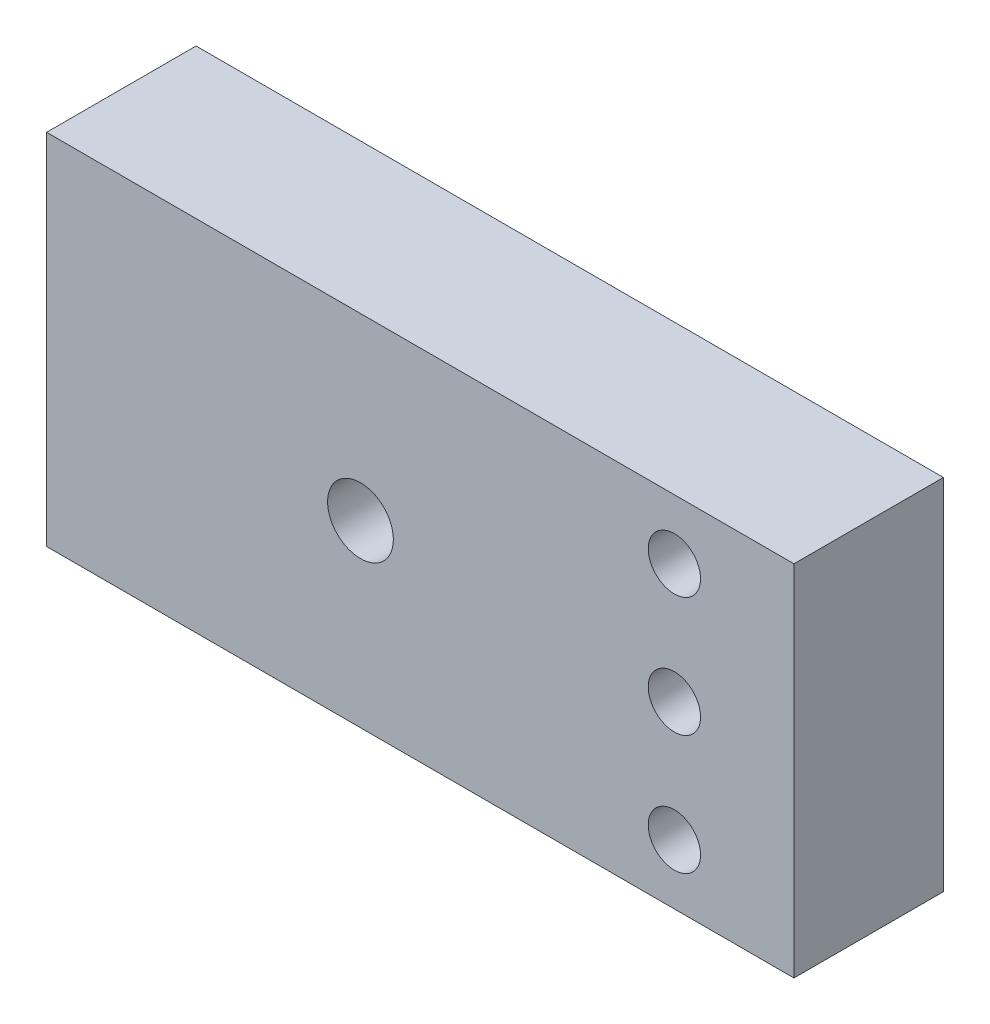
ISO-10303-21;
HEADER;
FILE_DESCRIPTION(('STEP AP214'),'2;1');
FILE_NAME('part.step','',(''),(''),'','','');
FILE_SCHEMA(('AUTOMOTIVE_DESIGN { 1 0 10303 214 1 1 1 1 }'));
ENDSEC;
DATA;
#1=APPLICATION_CONTEXT('core data for automotive mechanical design processes');
#2=APPLICATION_PROTOCOL_DEFINITION('international standard','automotive_design',2000,#1);
#3=PRODUCT_CONTEXT('',#1,'mechanical');
#4=PRODUCT('Part','Part','',(#3));
#5=PRODUCT_RELATED_PRODUCT_CATEGORY('part','',(#4));
#6=PRODUCT_DEFINITION_FORMATION('','',#4);
#7=PRODUCT_DEFINITION_CONTEXT('part definition',#1,'design');
#8=PRODUCT_DEFINITION('design','',#6,#7);
#9=PRODUCT_DEFINITION_SHAPE('','',#8);
#10=(LENGTH_UNIT() NAMED_UNIT(*) SI_UNIT(.MILLI.,.METRE.));
#11=(NAMED_UNIT(*) PLANE_ANGLE_UNIT() SI_UNIT($,.RADIAN.));
#12=(NAMED_UNIT(*) SI_UNIT($,.STERADIAN.) SOLID_ANGLE_UNIT());
#13=UNCERTAINTY_MEASURE_WITH_UNIT(LENGTH_MEASURE(1.E-05),#10,'distance_accuracy_value','');
#14=(GEOMETRIC_REPRESENTATION_CONTEXT(3) GLOBAL_UNCERTAINTY_ASSIGNED_CONTEXT((#13)) GLOBAL_UNIT_ASSIGNED_CONTEXT((#10,
#11,#12)) REPRESENTATION_CONTEXT('',''));
#15=CARTESIAN_POINT('',(0.,0.,0.));
#16=DIRECTION('',(0.,0.,1.));
#17=DIRECTION('',(1.,0.,0.));
#18=AXIS2_PLACEMENT_3D('',#15,#16,#17);
#19=CARTESIAN_POINT('',(125.,-60.,-50.));
#20=DIRECTION('',(1.,0.,0.));
#21=DIRECTION('',(0.,0.,-1.));
#22=AXIS2_PLACEMENT_3D('',#19,#20,#21);
#23=PLANE('',#22);
#24=DIRECTION('',(0.,1.,0.));
#25=VECTOR('',#24,1.);
#26=CARTESIAN_POINT('',(125.,-60.,0.));
#27=LINE('',#26,#25);
#28=CARTESIAN_POINT('',(125.,-60.,0.));
#29=VERTEX_POINT('',#28);
#30=CARTESIAN_POINT('',(125.,60.,0.));
#31=VERTEX_POINT('',#30);
#32=EDGE_CURVE('E102',#29,#31,#27,.T.);
#33=ORIENTED_EDGE('',*,*,#32,.F.);
#34=DIRECTION('',(0.,0.,1.));
#35=VECTOR('',#34,1.);
#36=CARTESIAN_POINT('',(125.,-60.,-50.));
#37=LINE('',#36,#35);
#38=CARTESIAN_POINT('',(125.,-60.,-50.));
#39=VERTEX_POINT('',#38);
#40=EDGE_CURVE('E11',#39,#29,#37,.T.);
#41=ORIENTED_EDGE('',*,*,#40,.F.);
#42=DIRECTION('',(0.,1.,0.));
#43=VECTOR('',#42,1.);
#44=CARTESIAN_POINT('',(125.,-60.,-50.));
#45=LINE('',#44,#43);
#46=CARTESIAN_POINT('',(125.,60.,-50.));
#47=VERTEX_POINT('',#46);
#48=EDGE_CURVE('E95',#39,#47,#45,.T.);
#49=ORIENTED_EDGE('',*,*,#48,.T.);
#50=DIRECTION('',(0.,0.,1.));
#51=VECTOR('',#50,1.);
#52=CARTESIAN_POINT('',(125.,60.,-50.));
#53=LINE('',#52,#51);
#54=EDGE_CURVE('E40',#47,#31,#53,.T.);
#55=ORIENTED_EDGE('',*,*,#54,.T.);
#56=EDGE_LOOP('',(#33,#41,#49,#55));
#57=FACE_BOUND('',#56,.T.);
#58=ADVANCED_FACE('F37',(#57),#23,.T.);
#59=CARTESIAN_POINT('',(-125.,-60.,-50.));
#60=DIRECTION('',(0.,-1.,0.));
#61=DIRECTION('',(0.,0.,-1.));
#62=AXIS2_PLACEMENT_3D('',#59,#60,#61);
#63=PLANE('',#62);
#64=DIRECTION('',(1.,0.,0.));
#65=VECTOR('',#64,1.);
#66=CARTESIAN_POINT('',(-125.,-60.,0.));
#67=LINE('',#66,#65);
#68=CARTESIAN_POINT('',(-125.,-60.,0.));
#69=VERTEX_POINT('',#68);
#70=EDGE_CURVE('E97',#69,#29,#67,.T.);
#71=ORIENTED_EDGE('',*,*,#70,.F.);
#72=DIRECTION('',(0.,0.,1.));
#73=VECTOR('',#72,1.);
#74=CARTESIAN_POINT('',(-125.,-60.,-50.));
#75=LINE('',#74,#73);
#76=CARTESIAN_POINT('',(-125.,-60.,-50.));
#77=VERTEX_POINT('',#76);
#78=EDGE_CURVE('E46',#77,#69,#75,.T.);
#79=ORIENTED_EDGE('',*,*,#78,.F.);
#80=DIRECTION('',(1.,0.,0.));
#81=VECTOR('',#80,1.);
#82=CARTESIAN_POINT('',(-125.,-60.,-50.));
#83=LINE('',#82,#81);
#84=EDGE_CURVE('E92',#77,#39,#83,.T.);
#85=ORIENTED_EDGE('',*,*,#84,.T.);
#86=ORIENTED_EDGE('',*,*,#40,.T.);
#87=EDGE_LOOP('',(#71,#79,#85,#86));
#88=FACE_BOUND('',#87,.T.);
#89=ADVANCED_FACE('F113',(#88),#63,.T.);
#90=CARTESIAN_POINT('',(-125.,-60.,-50.));
#91=DIRECTION('',(-1.,0.,0.));
#92=DIRECTION('',(0.,0.,1.));
#93=AXIS2_PLACEMENT_3D('',#90,#91,#92);
#94=PLANE('',#93);
#95=DIRECTION('',(0.,-1.,0.));
#96=VECTOR('',#95,1.);
#97=CARTESIAN_POINT('',(-125.,-60.,0.));
#98=LINE('',#97,#96);
#99=CARTESIAN_POINT('',(-125.,60.,0.));
#100=VERTEX_POINT('',#99);
#101=EDGE_CURVE('E87',#100,#69,#98,.T.);
#102=ORIENTED_EDGE('',*,*,#101,.F.);
#103=DIRECTION('',(0.,0.,1.));
#104=VECTOR('',#103,1.);
#105=CARTESIAN_POINT('',(-125.,60.,-50.));
#106=LINE('',#105,#104);
#107=CARTESIAN_POINT('',(-125.,60.,-50.));
#108=VERTEX_POINT('',#107);
#109=EDGE_CURVE('E82',#108,#100,#106,.T.);
#110=ORIENTED_EDGE('',*,*,#109,.F.);
#111=DIRECTION('',(0.,-1.,0.));
#112=VECTOR('',#111,1.);
#113=CARTESIAN_POINT('',(-125.,-60.,-50.));
#114=LINE('',#113,#112);
#115=EDGE_CURVE('E85',#108,#77,#114,.T.);
#116=ORIENTED_EDGE('',*,*,#115,.T.);
#117=ORIENTED_EDGE('',*,*,#78,.T.);
#118=EDGE_LOOP('',(#102,#110,#116,#117));
#119=FACE_BOUND('',#118,.T.);
#120=ADVANCED_FACE('F84',(#119),#94,.T.);
#121=CARTESIAN_POINT('',(-125.,60.,-50.));
#122=DIRECTION('',(0.,1.,0.));
#123=DIRECTION('',(0.,0.,1.));
#124=AXIS2_PLACEMENT_3D('',#121,#122,#123);
#125=PLANE('',#124);
#126=DIRECTION('',(-1.,0.,0.));
#127=VECTOR('',#126,1.);
#128=CARTESIAN_POINT('',(-125.,60.,0.));
#129=LINE('',#128,#127);
#130=EDGE_CURVE('E105',#31,#100,#129,.T.);
#131=ORIENTED_EDGE('',*,*,#130,.F.);
#132=ORIENTED_EDGE('',*,*,#54,.F.);
#133=DIRECTION('',(-1.,0.,0.));
#134=VECTOR('',#133,1.);
#135=CARTESIAN_POINT('',(-125.,60.,-50.));
#136=LINE('',#135,#134);
#137=EDGE_CURVE('E91',#47,#108,#136,.T.);
#138=ORIENTED_EDGE('',*,*,#137,.T.);
#139=ORIENTED_EDGE('',*,*,#109,.T.);
#140=EDGE_LOOP('',(#131,#132,#138,#139));
#141=FACE_BOUND('',#140,.T.);
#142=ADVANCED_FACE('F94',(#141),#125,.T.);
#143=CARTESIAN_POINT('',(0.,0.,-50.));
#144=DIRECTION('',(0.,0.,-1.));
#145=DIRECTION('',(-1.,0.,0.));
#146=AXIS2_PLACEMENT_3D('',#143,#144,#145);
#147=PLANE('',#146);
#148=CARTESIAN_POINT('',(85.,-40.,-50.));
#149=DIRECTION('',(0.,0.,1.));
#150=DIRECTION('',(1.,0.,0.));
#151=AXIS2_PLACEMENT_3D('',#148,#149,#150);
#152=CIRCLE('',#151,8.74999999999999);
#153=CARTESIAN_POINT('',(93.75,-40.,-50.));
#154=VERTEX_POINT('',#153);
#155=EDGE_CURVE('E154',#154,#154,#152,.T.);
#156=ORIENTED_EDGE('',*,*,#155,.T.);
#157=EDGE_LOOP('',(#156));
#158=FACE_BOUND('',#157,.T.);
#159=CARTESIAN_POINT('',(85.,40.,-50.));
#160=DIRECTION('',(0.,0.,1.));
#161=DIRECTION('',(1.,0.,0.));
#162=AXIS2_PLACEMENT_3D('',#159,#160,#161);
#163=CIRCLE('',#162,8.74999999999999);
#164=CARTESIAN_POINT('',(93.75,40.,-50.));
#165=VERTEX_POINT('',#164);
#166=EDGE_CURVE('E164',#165,#165,#163,.T.);
#167=ORIENTED_EDGE('',*,*,#166,.T.);
#168=EDGE_LOOP('',(#167));
#169=FACE_BOUND('',#168,.T.);
#170=CARTESIAN_POINT('',(85.,0.,-50.));
#171=DIRECTION('',(0.,0.,1.));
#172=DIRECTION('',(1.,0.,0.));
#173=AXIS2_PLACEMENT_3D('',#170,#171,#172);
#174=CIRCLE('',#173,8.74999999999999);
#175=CARTESIAN_POINT('',(93.75,0.,-50.));
#176=VERTEX_POINT('',#175);
#177=EDGE_CURVE('E170',#176,#176,#174,.T.);
#178=ORIENTED_EDGE('',*,*,#177,.T.);
#179=EDGE_LOOP('',(#178));
#180=FACE_BOUND('',#179,.T.);
#181=CARTESIAN_POINT('',(-19.9999999999999,0.,-50.));
#182=DIRECTION('',(0.,0.,1.));
#183=DIRECTION('',(1.,0.,0.));
#184=AXIS2_PLACEMENT_3D('',#181,#182,#183);
#185=CIRCLE('',#184,11.);
#186=CARTESIAN_POINT('',(-8.99999999999994,0.,-50.));
#187=VERTEX_POINT('',#186);
#188=EDGE_CURVE('E106',#187,#187,#185,.T.);
#189=ORIENTED_EDGE('',*,*,#188,.T.);
#190=EDGE_LOOP('',(#189));
#191=FACE_BOUND('',#190,.T.);
#192=ORIENTED_EDGE('',*,*,#48,.F.);
#193=ORIENTED_EDGE('',*,*,#84,.F.);
#194=ORIENTED_EDGE('',*,*,#115,.F.);
#195=ORIENTED_EDGE('',*,*,#137,.F.);
#196=EDGE_LOOP('',(#192,#193,#194,#195));
#197=FACE_BOUND('',#196,.T.);
#198=ADVANCED_FACE('F90',(#158,#169,#180,#191,#197),#147,.T.);
#199=CARTESIAN_POINT('',(0.,0.,0.));
#200=DIRECTION('',(0.,0.,-1.));
#201=DIRECTION('',(-1.,0.,0.));
#202=AXIS2_PLACEMENT_3D('',#199,#200,#201);
#203=PLANE('',#202);
#204=CARTESIAN_POINT('',(85.,-40.,0.));
#205=DIRECTION('',(0.,0.,1.));
#206=DIRECTION('',(1.,0.,0.));
#207=AXIS2_PLACEMENT_3D('',#204,#205,#206);
#208=CIRCLE('',#207,8.75000000000001);
#209=CARTESIAN_POINT('',(93.7500000000001,-40.,0.));
#210=VERTEX_POINT('',#209);
#211=EDGE_CURVE('E157',#210,#210,#208,.T.);
#212=ORIENTED_EDGE('',*,*,#211,.F.);
#213=EDGE_LOOP('',(#212));
#214=FACE_BOUND('',#213,.T.);
#215=CARTESIAN_POINT('',(85.,40.,0.));
#216=DIRECTION('',(0.,0.,1.));
#217=DIRECTION('',(1.,0.,0.));
#218=AXIS2_PLACEMENT_3D('',#215,#216,#217);
#219=CIRCLE('',#218,8.75000000000001);
#220=CARTESIAN_POINT('',(93.7500000000001,40.,0.));
#221=VERTEX_POINT('',#220);
#222=EDGE_CURVE('E159',#221,#221,#219,.T.);
#223=ORIENTED_EDGE('',*,*,#222,.F.);
#224=EDGE_LOOP('',(#223));
#225=FACE_BOUND('',#224,.T.);
#226=CARTESIAN_POINT('',(85.,0.,0.));
#227=DIRECTION('',(0.,0.,1.));
#228=DIRECTION('',(1.,0.,0.));
#229=AXIS2_PLACEMENT_3D('',#226,#227,#228);
#230=CIRCLE('',#229,8.75000000000001);
#231=CARTESIAN_POINT('',(93.7500000000001,0.,0.));
#232=VERTEX_POINT('',#231);
#233=EDGE_CURVE('E167',#232,#232,#230,.T.);
#234=ORIENTED_EDGE('',*,*,#233,.F.);
#235=EDGE_LOOP('',(#234));
#236=FACE_BOUND('',#235,.T.);
#237=CARTESIAN_POINT('',(-19.9999999999999,0.,0.));
#238=DIRECTION('',(0.,0.,1.));
#239=DIRECTION('',(1.,0.,0.));
#240=AXIS2_PLACEMENT_3D('',#237,#238,#239);
#241=CIRCLE('',#240,11.);
#242=CARTESIAN_POINT('',(-8.99999999999993,0.,0.));
#243=VERTEX_POINT('',#242);
#244=EDGE_CURVE('E173',#243,#243,#241,.T.);
#245=ORIENTED_EDGE('',*,*,#244,.F.);
#246=EDGE_LOOP('',(#245));
#247=FACE_BOUND('',#246,.T.);
#248=ORIENTED_EDGE('',*,*,#32,.T.);
#249=ORIENTED_EDGE('',*,*,#130,.T.);
#250=ORIENTED_EDGE('',*,*,#101,.T.);
#251=ORIENTED_EDGE('',*,*,#70,.T.);
#252=EDGE_LOOP('',(#248,#249,#250,#251));
#253=FACE_BOUND('',#252,.T.);
#254=ADVANCED_FACE('F112',(#214,#225,#236,#247,#253),#203,.F.);
#255=CARTESIAN_POINT('',(-19.9999999999999,0.,0.));
#256=DIRECTION('',(0.,0.,1.));
#257=DIRECTION('',(1.,0.,0.));
#258=AXIS2_PLACEMENT_3D('',#255,#256,#257);
#259=CYLINDRICAL_SURFACE('',#258,11.);
#260=ORIENTED_EDGE('',*,*,#188,.F.);
#261=EDGE_LOOP('',(#260));
#262=FACE_BOUND('',#261,.T.);
#263=ORIENTED_EDGE('',*,*,#244,.T.);
#264=EDGE_LOOP('',(#263));
#265=FACE_BOUND('',#264,.T.);
#266=ADVANCED_FACE('F131',(#262,#265),#259,.F.);
#267=CARTESIAN_POINT('',(85.,0.,0.));
#268=DIRECTION('',(0.,0.,1.));
#269=DIRECTION('',(1.,0.,0.));
#270=AXIS2_PLACEMENT_3D('',#267,#268,#269);
#271=CYLINDRICAL_SURFACE('',#270,8.75);
#272=ORIENTED_EDGE('',*,*,#177,.F.);
#273=EDGE_LOOP('',(#272));
#274=FACE_BOUND('',#273,.T.);
#275=ORIENTED_EDGE('',*,*,#233,.T.);
#276=EDGE_LOOP('',(#275));
#277=FACE_BOUND('',#276,.T.);
#278=ADVANCED_FACE('F138',(#274,#277),#271,.F.);
#279=CARTESIAN_POINT('',(85.,40.,0.));
#280=DIRECTION('',(0.,0.,1.));
#281=DIRECTION('',(1.,0.,0.));
#282=AXIS2_PLACEMENT_3D('',#279,#280,#281);
#283=CYLINDRICAL_SURFACE('',#282,8.75);
#284=ORIENTED_EDGE('',*,*,#166,.F.);
#285=EDGE_LOOP('',(#284));
#286=FACE_BOUND('',#285,.T.);
#287=ORIENTED_EDGE('',*,*,#222,.T.);
#288=EDGE_LOOP('',(#287));
#289=FACE_BOUND('',#288,.T.);
#290=ADVANCED_FACE('F142',(#286,#289),#283,.F.);
#291=CARTESIAN_POINT('',(85.,-40.,0.));
#292=DIRECTION('',(0.,0.,1.));
#293=DIRECTION('',(1.,0.,0.));
#294=AXIS2_PLACEMENT_3D('',#291,#292,#293);
#295=CYLINDRICAL_SURFACE('',#294,8.75);
#296=ORIENTED_EDGE('',*,*,#155,.F.);
#297=EDGE_LOOP('',(#296));
#298=FACE_BOUND('',#297,.T.);
#299=ORIENTED_EDGE('',*,*,#211,.T.);
#300=EDGE_LOOP('',(#299));
#301=FACE_BOUND('',#300,.T.);
#302=ADVANCED_FACE('F146',(#298,#301),#295,.F.);
#303=CLOSED_SHELL('',(#58,#89,#120,#142,#198,#254,#266,#278,#290,#302));
#304=MANIFOLD_SOLID_BREP('B2',#303);
#305=ADVANCED_BREP_SHAPE_REPRESENTATION('',(#18,#304),#14);
#306=SHAPE_DEFINITION_REPRESENTATION(#9,#305);
ENDSEC;
END-ISO-10303-21;
